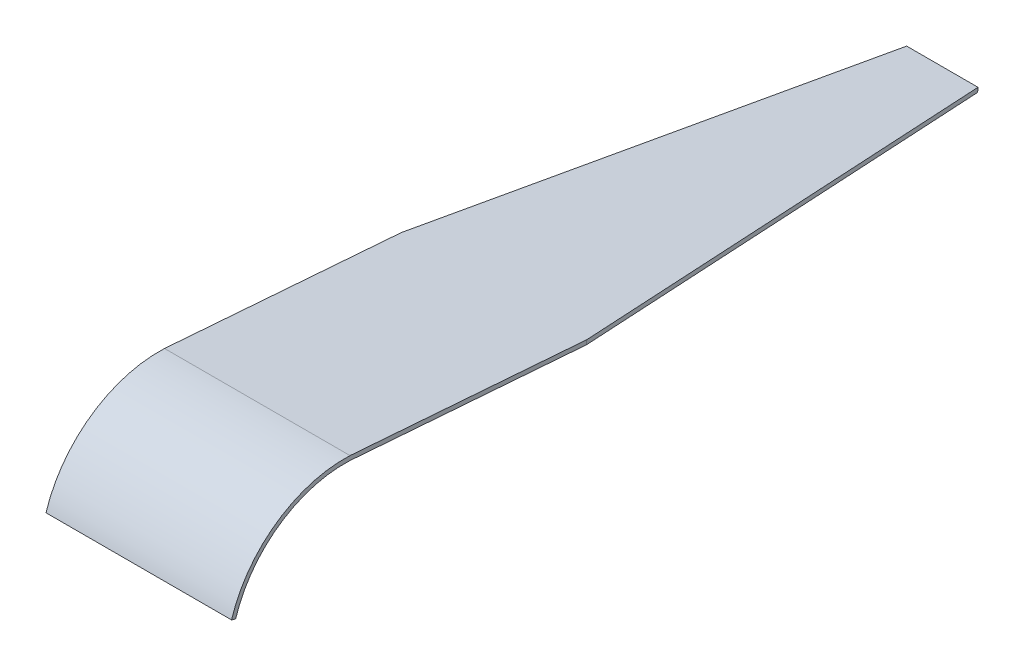
ISO-10303-21;
HEADER;
FILE_DESCRIPTION(('STEP AP214'),'2;1');
FILE_NAME('part.step','',(''),(''),'','','');
FILE_SCHEMA(('AUTOMOTIVE_DESIGN { 1 0 10303 214 1 1 1 1 }'));
ENDSEC;
DATA;
#1=APPLICATION_CONTEXT('core data for automotive mechanical design processes');
#2=APPLICATION_PROTOCOL_DEFINITION('international standard','automotive_design',2000,#1);
#3=PRODUCT_CONTEXT('',#1,'mechanical');
#4=PRODUCT('Part','Part','',(#3));
#5=PRODUCT_RELATED_PRODUCT_CATEGORY('part','',(#4));
#6=PRODUCT_DEFINITION_FORMATION('','',#4);
#7=PRODUCT_DEFINITION_CONTEXT('part definition',#1,'design');
#8=PRODUCT_DEFINITION('design','',#6,#7);
#9=PRODUCT_DEFINITION_SHAPE('','',#8);
#10=(LENGTH_UNIT() NAMED_UNIT(*) SI_UNIT(.MILLI.,.METRE.));
#11=(NAMED_UNIT(*) PLANE_ANGLE_UNIT() SI_UNIT($,.RADIAN.));
#12=(NAMED_UNIT(*) SI_UNIT($,.STERADIAN.) SOLID_ANGLE_UNIT());
#13=UNCERTAINTY_MEASURE_WITH_UNIT(LENGTH_MEASURE(1.E-05),#10,'distance_accuracy_value','');
#14=(GEOMETRIC_REPRESENTATION_CONTEXT(3) GLOBAL_UNCERTAINTY_ASSIGNED_CONTEXT((#13)) GLOBAL_UNIT_ASSIGNED_CONTEXT((#10,
#11,#12)) REPRESENTATION_CONTEXT('',''));
#15=CARTESIAN_POINT('',(0.,0.,0.));
#16=DIRECTION('',(0.,0.,1.));
#17=DIRECTION('',(1.,0.,0.));
#18=AXIS2_PLACEMENT_3D('',#15,#16,#17);
#19=CARTESIAN_POINT('',(65.,9.7979589711327,-173.642321833562));
#20=DIRECTION('',(0.,-0.997120639636203,0.0758315897992965));
#21=DIRECTION('',(0.,-0.0758315897992965,-0.997120639636203));
#22=AXIS2_PLACEMENT_3D('',#19,#20,#21);
#23=PLANE('',#22);
#24=DIRECTION('',(-1.,0.,0.));
#25=VECTOR('',#24,1.);
#26=CARTESIAN_POINT('',(65.,9.7979589711327,-173.642321833562));
#27=LINE('',#26,#25);
#28=CARTESIAN_POINT('',(45.,9.79795897113289,-173.642321833562));
#29=VERTEX_POINT('',#28);
#30=CARTESIAN_POINT('',(20.,9.79795897113289,-173.642321833562));
#31=VERTEX_POINT('',#30);
#32=EDGE_CURVE('E115',#29,#31,#27,.T.);
#33=ORIENTED_EDGE('',*,*,#32,.F.);
#34=DIRECTION('',(0.125962693759281,0.0752275896025427,0.989178552913223));
#35=VECTOR('',#34,1.);
#36=CARTESIAN_POINT('',(45.3173320043819,9.98747636775978,-171.150329930884));
#37=LINE('',#36,#35);
#38=CARTESIAN_POINT('',(65.,21.7423827298539,-16.5833508967253));
#39=VERTEX_POINT('',#38);
#40=EDGE_CURVE('E98',#29,#39,#37,.T.);
#41=ORIENTED_EDGE('',*,*,#40,.T.);
#42=DIRECTION('',(0.,0.0758315897992965,0.997120639636203));
#43=VECTOR('',#42,1.);
#44=CARTESIAN_POINT('',(65.,9.7979589711327,-173.642321833562));
#45=LINE('',#44,#43);
#46=CARTESIAN_POINT('',(65.,28.050095,66.3576781664384));
#47=VERTEX_POINT('',#46);
#48=EDGE_CURVE('E152',#39,#47,#45,.T.);
#49=ORIENTED_EDGE('',*,*,#48,.T.);
#50=DIRECTION('',(-1.,0.,0.));
#51=VECTOR('',#50,1.);
#52=CARTESIAN_POINT('',(65.,28.050095,66.3576781664384));
#53=LINE('',#52,#51);
#54=CARTESIAN_POINT('',(0.,28.050095,66.3576781664384));
#55=VERTEX_POINT('',#54);
#56=EDGE_CURVE('E118',#47,#55,#53,.T.);
#57=ORIENTED_EDGE('',*,*,#56,.T.);
#58=DIRECTION('',(0.,0.0758315897992965,0.997120639636203));
#59=VECTOR('',#58,1.);
#60=CARTESIAN_POINT('',(0.,9.7979589711327,-173.642321833562));
#61=LINE('',#60,#59);
#62=CARTESIAN_POINT('',(0.,21.7423827298538,-16.5833508967253));
#63=VERTEX_POINT('',#62);
#64=EDGE_CURVE('E134',#63,#55,#61,.T.);
#65=ORIENTED_EDGE('',*,*,#64,.F.);
#66=DIRECTION('',(-0.125962693759281,0.0752275896025427,0.989178552913223));
#67=VECTOR('',#66,1.);
#68=CARTESIAN_POINT('',(20.7139970098592,9.37154482872177,-179.249303614585));
#69=LINE('',#68,#67);
#70=EDGE_CURVE('E54',#31,#63,#69,.T.);
#71=ORIENTED_EDGE('',*,*,#70,.F.);
#72=EDGE_LOOP('',(#33,#41,#49,#57,#65,#71));
#73=FACE_BOUND('',#72,.T.);
#74=ADVANCED_FACE('F32',(#73),#23,.T.);
#75=CARTESIAN_POINT('',(65.,11.293639930587,-173.756069218261));
#76=DIRECTION('',(0.,-0.0758315897992912,-0.997120639636204));
#77=DIRECTION('',(0.,0.997120639636204,-0.0758315897992912));
#78=AXIS2_PLACEMENT_3D('',#75,#76,#77);
#79=PLANE('',#78);
#80=DIRECTION('',(-1.,0.,0.));
#81=VECTOR('',#80,1.);
#82=CARTESIAN_POINT('',(65.,11.293639930587,-173.756069218261));
#83=LINE('',#82,#81);
#84=CARTESIAN_POINT('',(45.,11.2936399305871,-173.756069218261));
#85=VERTEX_POINT('',#84);
#86=CARTESIAN_POINT('',(20.,11.293639930587,-173.756069218261));
#87=VERTEX_POINT('',#86);
#88=EDGE_CURVE('E107',#85,#87,#83,.T.);
#89=ORIENTED_EDGE('',*,*,#88,.F.);
#90=DIRECTION('',(0.,-0.997120639636203,0.0758315897992965));
#91=VECTOR('',#90,1.);
#92=CARTESIAN_POINT('',(45.,413.418296413397,-204.337877262785));
#93=LINE('',#92,#91);
#94=EDGE_CURVE('E95',#85,#29,#93,.T.);
#95=ORIENTED_EDGE('',*,*,#94,.T.);
#96=ORIENTED_EDGE('',*,*,#32,.T.);
#97=DIRECTION('',(0.,-0.997120639636203,0.0758315897992965));
#98=VECTOR('',#97,1.);
#99=CARTESIAN_POINT('',(20.,413.418296413397,-204.337877262785));
#100=LINE('',#99,#98);
#101=EDGE_CURVE('E114',#87,#31,#100,.T.);
#102=ORIENTED_EDGE('',*,*,#101,.F.);
#103=EDGE_LOOP('',(#89,#95,#96,#102));
#104=FACE_BOUND('',#103,.T.);
#105=ADVANCED_FACE('F113',(#104),#79,.T.);
#106=CARTESIAN_POINT('',(65.,11.293639930587,-173.756069218261));
#107=DIRECTION('',(0.,-0.997120639636203,0.0758315897992965));
#108=DIRECTION('',(0.,-0.0758315897992965,-0.997120639636203));
#109=AXIS2_PLACEMENT_3D('',#106,#107,#108);
#110=PLANE('',#109);
#111=DIRECTION('',(0.125962693759281,0.0752275896025427,0.989178552913223));
#112=VECTOR('',#111,1.);
#113=CARTESIAN_POINT('',(45.3173320043819,11.4831573272141,-171.264077315583));
#114=LINE('',#113,#112);
#115=CARTESIAN_POINT('',(65.,23.2380636893081,-16.6970982814243));
#116=VERTEX_POINT('',#115);
#117=EDGE_CURVE('E47',#85,#116,#114,.T.);
#118=ORIENTED_EDGE('',*,*,#117,.F.);
#119=ORIENTED_EDGE('',*,*,#88,.T.);
#120=DIRECTION('',(-0.125962693759281,0.0752275896025427,0.989178552913223));
#121=VECTOR('',#120,1.);
#122=CARTESIAN_POINT('',(20.7139970098592,10.8672257881761,-179.363050999284));
#123=LINE('',#122,#121);
#124=CARTESIAN_POINT('',(0.,23.2380636893082,-16.6970982814243));
#125=VERTEX_POINT('',#124);
#126=EDGE_CURVE('E162',#87,#125,#123,.T.);
#127=ORIENTED_EDGE('',*,*,#126,.T.);
#128=DIRECTION('',(0.,0.0758315897992965,0.997120639636203));
#129=VECTOR('',#128,1.);
#130=CARTESIAN_POINT('',(0.,11.293639930587,-173.756069218261));
#131=LINE('',#130,#129);
#132=CARTESIAN_POINT('',(0.,29.5474971657849,66.2665631749391));
#133=VERTEX_POINT('',#132);
#134=EDGE_CURVE('E136',#125,#133,#131,.T.);
#135=ORIENTED_EDGE('',*,*,#134,.T.);
#136=DIRECTION('',(-1.,0.,0.));
#137=VECTOR('',#136,1.);
#138=CARTESIAN_POINT('',(65.,29.5474971657849,66.2665631749391));
#139=LINE('',#138,#137);
#140=CARTESIAN_POINT('',(65.,29.5474971657849,66.2665631749391));
#141=VERTEX_POINT('',#140);
#142=EDGE_CURVE('E116',#141,#133,#139,.T.);
#143=ORIENTED_EDGE('',*,*,#142,.F.);
#144=DIRECTION('',(0.,0.0758315897992965,0.997120639636203));
#145=VECTOR('',#144,1.);
#146=CARTESIAN_POINT('',(65.,11.293639930587,-173.756069218261));
#147=LINE('',#146,#145);
#148=EDGE_CURVE('E110',#116,#141,#147,.T.);
#149=ORIENTED_EDGE('',*,*,#148,.F.);
#150=EDGE_LOOP('',(#118,#119,#127,#135,#143,#149));
#151=FACE_BOUND('',#150,.T.);
#152=ADVANCED_FACE('F105',(#151),#110,.F.);
#153=CARTESIAN_POINT('',(65.,-11.9087578529011,68.1715355699288));
#154=DIRECTION('',(1.,0.,0.));
#155=DIRECTION('',(0.,0.,-1.));
#156=AXIS2_PLACEMENT_3D('',#153,#154,#155);
#157=PLANE('',#156);
#158=ORIENTED_EDGE('',*,*,#48,.F.);
#159=DIRECTION('',(0.,0.997120639636203,-0.0758315897992965));
#160=VECTOR('',#159,1.);
#161=CARTESIAN_POINT('',(65.,-18.1238411775849,-13.5515019729093));
#162=LINE('',#161,#160);
#163=EDGE_CURVE('E11',#39,#116,#162,.T.);
#164=ORIENTED_EDGE('',*,*,#163,.T.);
#165=ORIENTED_EDGE('',*,*,#148,.T.);
#166=CARTESIAN_POINT('',(65.,-11.9087578529011,68.1715355699288));
#167=DIRECTION('',(1.,0.,0.));
#168=DIRECTION('',(0.,0.,-1.));
#169=AXIS2_PLACEMENT_3D('',#166,#167,#168);
#170=CIRCLE('',#169,41.5);
#171=CARTESIAN_POINT('',(65.,0.446578419483789,107.789658513808));
#172=VERTEX_POINT('',#171);
#173=EDGE_CURVE('E142',#141,#172,#170,.T.);
#174=ORIENTED_EDGE('',*,*,#173,.T.);
#175=DIRECTION('',(0.,0.297718946322527,0.95465356491274));
#176=VECTOR('',#175,1.);
#177=CARTESIAN_POINT('',(65.,0.,106.357678166438));
#178=LINE('',#177,#176);
#179=CARTESIAN_POINT('',(65.,0.,106.357678166438));
#180=VERTEX_POINT('',#179);
#181=EDGE_CURVE('E157',#180,#172,#178,.T.);
#182=ORIENTED_EDGE('',*,*,#181,.F.);
#183=CARTESIAN_POINT('',(65.,-11.9087578529011,68.1715355699288));
#184=DIRECTION('',(1.,0.,0.));
#185=DIRECTION('',(0.,0.,1.));
#186=AXIS2_PLACEMENT_3D('',#183,#184,#185);
#187=CIRCLE('',#186,40.);
#188=EDGE_CURVE('E154',#47,#180,#187,.T.);
#189=ORIENTED_EDGE('',*,*,#188,.F.);
#190=EDGE_LOOP('',(#158,#164,#165,#174,#182,#189));
#191=FACE_BOUND('',#190,.T.);
#192=ADVANCED_FACE('F168',(#191),#157,.T.);
#193=CARTESIAN_POINT('',(65.,-11.9087578529011,68.1715355699288));
#194=DIRECTION('',(-1.,0.,0.));
#195=DIRECTION('',(0.,0.,1.));
#196=AXIS2_PLACEMENT_3D('',#193,#194,#195);
#197=CYLINDRICAL_SURFACE('',#196,41.5);
#198=CARTESIAN_POINT('',(0.,-11.9087578529011,68.1715355699288));
#199=DIRECTION('',(1.,0.,0.));
#200=DIRECTION('',(0.,0.,-1.));
#201=AXIS2_PLACEMENT_3D('',#198,#199,#200);
#202=CIRCLE('',#201,41.5);
#203=CARTESIAN_POINT('',(0.,0.446578419483789,107.789658513808));
#204=VERTEX_POINT('',#203);
#205=EDGE_CURVE('E148',#133,#204,#202,.T.);
#206=ORIENTED_EDGE('',*,*,#205,.T.);
#207=DIRECTION('',(-1.,0.,0.));
#208=VECTOR('',#207,1.);
#209=CARTESIAN_POINT('',(65.,0.446578419483789,107.789658513808));
#210=LINE('',#209,#208);
#211=EDGE_CURVE('E128',#172,#204,#210,.T.);
#212=ORIENTED_EDGE('',*,*,#211,.F.);
#213=ORIENTED_EDGE('',*,*,#173,.F.);
#214=ORIENTED_EDGE('',*,*,#142,.T.);
#215=EDGE_LOOP('',(#206,#212,#213,#214));
#216=FACE_BOUND('',#215,.T.);
#217=ADVANCED_FACE('F34',(#216),#197,.T.);
#218=CARTESIAN_POINT('',(65.,0.,106.357678166438));
#219=DIRECTION('',(0.,-0.95465356491274,0.297718946322527));
#220=DIRECTION('',(0.,-0.297718946322527,-0.954653564912741));
#221=AXIS2_PLACEMENT_3D('',#218,#219,#220);
#222=PLANE('',#221);
#223=DIRECTION('',(0.,0.297718946322527,0.95465356491274));
#224=VECTOR('',#223,1.);
#225=CARTESIAN_POINT('',(0.,0.,106.357678166438));
#226=LINE('',#225,#224);
#227=CARTESIAN_POINT('',(0.,0.,106.357678166438));
#228=VERTEX_POINT('',#227);
#229=EDGE_CURVE('E143',#228,#204,#226,.T.);
#230=ORIENTED_EDGE('',*,*,#229,.F.);
#231=DIRECTION('',(-1.,0.,0.));
#232=VECTOR('',#231,1.);
#233=CARTESIAN_POINT('',(65.,0.,106.357678166438));
#234=LINE('',#233,#232);
#235=EDGE_CURVE('E126',#180,#228,#234,.T.);
#236=ORIENTED_EDGE('',*,*,#235,.F.);
#237=ORIENTED_EDGE('',*,*,#181,.T.);
#238=ORIENTED_EDGE('',*,*,#211,.T.);
#239=EDGE_LOOP('',(#230,#236,#237,#238));
#240=FACE_BOUND('',#239,.T.);
#241=ADVANCED_FACE('F174',(#240),#222,.T.);
#242=CARTESIAN_POINT('',(65.,-11.9087578529011,68.1715355699288));
#243=DIRECTION('',(-1.,0.,0.));
#244=DIRECTION('',(0.,0.,1.));
#245=AXIS2_PLACEMENT_3D('',#242,#243,#244);
#246=CYLINDRICAL_SURFACE('',#245,40.);
#247=CARTESIAN_POINT('',(0.,-11.9087578529011,68.1715355699288));
#248=DIRECTION('',(1.,0.,0.));
#249=DIRECTION('',(0.,0.,1.));
#250=AXIS2_PLACEMENT_3D('',#247,#248,#249);
#251=CIRCLE('',#250,40.);
#252=EDGE_CURVE('E140',#55,#228,#251,.T.);
#253=ORIENTED_EDGE('',*,*,#252,.F.);
#254=ORIENTED_EDGE('',*,*,#56,.F.);
#255=ORIENTED_EDGE('',*,*,#188,.T.);
#256=ORIENTED_EDGE('',*,*,#235,.T.);
#257=EDGE_LOOP('',(#253,#254,#255,#256));
#258=FACE_BOUND('',#257,.T.);
#259=ADVANCED_FACE('F171',(#258),#246,.F.);
#260=CARTESIAN_POINT('',(0.,-11.9087578529011,68.1715355699288));
#261=DIRECTION('',(1.,0.,0.));
#262=DIRECTION('',(0.,0.,-1.));
#263=AXIS2_PLACEMENT_3D('',#260,#261,#262);
#264=PLANE('',#263);
#265=ORIENTED_EDGE('',*,*,#134,.F.);
#266=DIRECTION('',(0.,-0.997120639636203,0.0758315897992965));
#267=VECTOR('',#266,1.);
#268=CARTESIAN_POINT('',(0.,-18.1238411775849,-13.5515019729092));
#269=LINE('',#268,#267);
#270=EDGE_CURVE('E40',#125,#63,#269,.T.);
#271=ORIENTED_EDGE('',*,*,#270,.T.);
#272=ORIENTED_EDGE('',*,*,#64,.T.);
#273=ORIENTED_EDGE('',*,*,#252,.T.);
#274=ORIENTED_EDGE('',*,*,#229,.T.);
#275=ORIENTED_EDGE('',*,*,#205,.F.);
#276=EDGE_LOOP('',(#265,#271,#272,#273,#274,#275));
#277=FACE_BOUND('',#276,.T.);
#278=ADVANCED_FACE('F132',(#277),#264,.F.);
#279=CARTESIAN_POINT('',(20.,413.418296413397,-204.337877262785));
#280=DIRECTION('',(0.992034979111576,0.00955195132316817,0.125600001771553));
#281=DIRECTION('',(0.125605732021569,0.,-0.992080238732395));
#282=AXIS2_PLACEMENT_3D('',#279,#280,#281);
#283=PLANE('',#282);
#284=ORIENTED_EDGE('',*,*,#101,.T.);
#285=ORIENTED_EDGE('',*,*,#70,.T.);
#286=ORIENTED_EDGE('',*,*,#270,.F.);
#287=ORIENTED_EDGE('',*,*,#126,.F.);
#288=EDGE_LOOP('',(#284,#285,#286,#287));
#289=FACE_BOUND('',#288,.T.);
#290=ADVANCED_FACE('F178',(#289),#283,.F.);
#291=CARTESIAN_POINT('',(45.,413.418296413397,-204.337877262785));
#292=DIRECTION('',(0.992034979111576,-0.00955195132316817,-0.125600001771553));
#293=DIRECTION('',(-0.125605732021569,0.,-0.992080238732395));
#294=AXIS2_PLACEMENT_3D('',#291,#292,#293);
#295=PLANE('',#294);
#296=ORIENTED_EDGE('',*,*,#40,.F.);
#297=ORIENTED_EDGE('',*,*,#94,.F.);
#298=ORIENTED_EDGE('',*,*,#117,.T.);
#299=ORIENTED_EDGE('',*,*,#163,.F.);
#300=EDGE_LOOP('',(#296,#297,#298,#299));
#301=FACE_BOUND('',#300,.T.);
#302=ADVANCED_FACE('F96',(#301),#295,.T.);
#303=CLOSED_SHELL('',(#74,#105,#152,#192,#217,#241,#259,#278,#290,#302));
#304=MANIFOLD_SOLID_BREP('B2',#303);
#305=ADVANCED_BREP_SHAPE_REPRESENTATION('',(#18,#304),#14);
#306=SHAPE_DEFINITION_REPRESENTATION(#9,#305);
ENDSEC;
END-ISO-10303-21;
